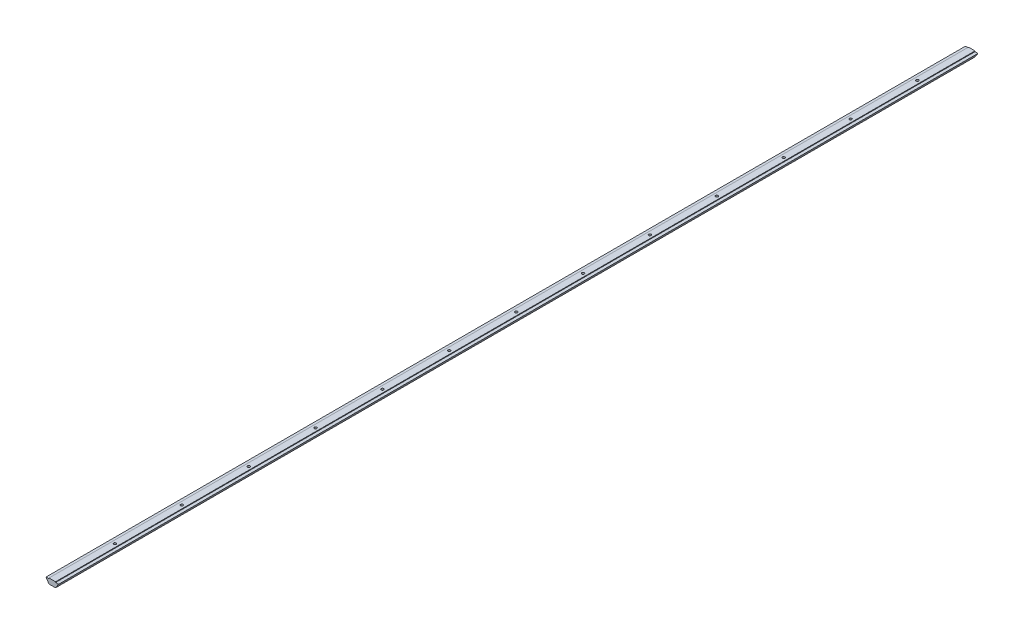
ISO-10303-21;
HEADER;
FILE_DESCRIPTION(('STEP AP214'),'2;1');
FILE_NAME('part.step','',(''),(''),'','','');
FILE_SCHEMA(('AUTOMOTIVE_DESIGN { 1 0 10303 214 1 1 1 1 }'));
ENDSEC;
DATA;
#1=APPLICATION_CONTEXT('core data for automotive mechanical design processes');
#2=APPLICATION_PROTOCOL_DEFINITION('international standard','automotive_design',2000,#1);
#3=PRODUCT_CONTEXT('',#1,'mechanical');
#4=PRODUCT('Part','Part','',(#3));
#5=PRODUCT_RELATED_PRODUCT_CATEGORY('part','',(#4));
#6=PRODUCT_DEFINITION_FORMATION('','',#4);
#7=PRODUCT_DEFINITION_CONTEXT('part definition',#1,'design');
#8=PRODUCT_DEFINITION('design','',#6,#7);
#9=PRODUCT_DEFINITION_SHAPE('','',#8);
#10=(LENGTH_UNIT() NAMED_UNIT(*) SI_UNIT(.MILLI.,.METRE.));
#11=(NAMED_UNIT(*) PLANE_ANGLE_UNIT() SI_UNIT($,.RADIAN.));
#12=(NAMED_UNIT(*) SI_UNIT($,.STERADIAN.) SOLID_ANGLE_UNIT());
#13=UNCERTAINTY_MEASURE_WITH_UNIT(LENGTH_MEASURE(1.E-05),#10,'distance_accuracy_value','');
#14=(GEOMETRIC_REPRESENTATION_CONTEXT(3) GLOBAL_UNCERTAINTY_ASSIGNED_CONTEXT((#13)) GLOBAL_UNIT_ASSIGNED_CONTEXT((#10,
#11,#12)) REPRESENTATION_CONTEXT('',''));
#15=CARTESIAN_POINT('',(0.,0.,0.));
#16=DIRECTION('',(0.,0.,1.));
#17=DIRECTION('',(1.,0.,0.));
#18=AXIS2_PLACEMENT_3D('',#15,#16,#17);
#19=CARTESIAN_POINT('',(-3.9,0.,1100.));
#20=DIRECTION('',(0.836701516894204,0.547659174694388,0.));
#21=DIRECTION('',(-0.547659174694388,0.836701516894204,0.));
#22=AXIS2_PLACEMENT_3D('',#19,#20,#21);
#23=PLANE('',#22);
#24=DIRECTION('',(0.547659174694388,-0.836701516894204,0.));
#25=VECTOR('',#24,1.);
#26=CARTESIAN_POINT('',(-3.9,0.,0.));
#27=LINE('',#26,#25);
#28=CARTESIAN_POINT('',(-7.5,5.5,0.));
#29=VERTEX_POINT('',#28);
#30=CARTESIAN_POINT('',(-3.9,0.,0.));
#31=VERTEX_POINT('',#30);
#32=EDGE_CURVE('E131',#29,#31,#27,.T.);
#33=ORIENTED_EDGE('',*,*,#32,.T.);
#34=DIRECTION('',(0.,0.,-1.));
#35=VECTOR('',#34,1.);
#36=CARTESIAN_POINT('',(-3.9,0.,1100.));
#37=LINE('',#36,#35);
#38=CARTESIAN_POINT('',(-3.9,0.,1100.));
#39=VERTEX_POINT('',#38);
#40=EDGE_CURVE('E11',#39,#31,#37,.T.);
#41=ORIENTED_EDGE('',*,*,#40,.F.);
#42=DIRECTION('',(0.547659174694388,-0.836701516894204,0.));
#43=VECTOR('',#42,1.);
#44=CARTESIAN_POINT('',(-3.9,0.,1100.));
#45=LINE('',#44,#43);
#46=CARTESIAN_POINT('',(-7.5,5.5,1100.));
#47=VERTEX_POINT('',#46);
#48=EDGE_CURVE('E146',#47,#39,#45,.T.);
#49=ORIENTED_EDGE('',*,*,#48,.F.);
#50=DIRECTION('',(0.,0.,-1.));
#51=VECTOR('',#50,1.);
#52=CARTESIAN_POINT('',(-7.5,5.5,1100.));
#53=LINE('',#52,#51);
#54=EDGE_CURVE('E127',#47,#29,#53,.T.);
#55=ORIENTED_EDGE('',*,*,#54,.T.);
#56=EDGE_LOOP('',(#33,#41,#49,#55));
#57=FACE_BOUND('',#56,.T.);
#58=ADVANCED_FACE('F35',(#57),#23,.F.);
#59=CARTESIAN_POINT('',(3.9,0.,1100.));
#60=DIRECTION('',(0.,1.,0.));
#61=DIRECTION('',(0.,0.,1.));
#62=AXIS2_PLACEMENT_3D('',#59,#60,#61);
#63=PLANE('',#62);
#64=CARTESIAN_POINT('',(0.,0.,1025.));
#65=DIRECTION('',(0.,1.,0.));
#66=DIRECTION('',(0.,0.,1.));
#67=AXIS2_PLACEMENT_3D('',#64,#65,#66);
#68=CIRCLE('',#67,1.49999999999997);
#69=CARTESIAN_POINT('',(0.,0.,1026.5));
#70=VERTEX_POINT('',#69);
#71=EDGE_CURVE('E248',#70,#70,#68,.T.);
#72=ORIENTED_EDGE('',*,*,#71,.T.);
#73=EDGE_LOOP('',(#72));
#74=FACE_BOUND('',#73,.T.);
#75=CARTESIAN_POINT('',(0.,0.,945.));
#76=DIRECTION('',(0.,1.,0.));
#77=DIRECTION('',(0.,0.,1.));
#78=AXIS2_PLACEMENT_3D('',#75,#76,#77);
#79=CIRCLE('',#78,1.5);
#80=CARTESIAN_POINT('',(0.,0.,946.5));
#81=VERTEX_POINT('',#80);
#82=EDGE_CURVE('E242',#81,#81,#79,.T.);
#83=ORIENTED_EDGE('',*,*,#82,.T.);
#84=EDGE_LOOP('',(#83));
#85=FACE_BOUND('',#84,.T.);
#86=CARTESIAN_POINT('',(0.,0.,865.));
#87=DIRECTION('',(0.,1.,0.));
#88=DIRECTION('',(0.,0.,1.));
#89=AXIS2_PLACEMENT_3D('',#86,#87,#88);
#90=CIRCLE('',#89,1.5);
#91=CARTESIAN_POINT('',(0.,0.,866.5));
#92=VERTEX_POINT('',#91);
#93=EDGE_CURVE('E236',#92,#92,#90,.T.);
#94=ORIENTED_EDGE('',*,*,#93,.T.);
#95=EDGE_LOOP('',(#94));
#96=FACE_BOUND('',#95,.T.);
#97=CARTESIAN_POINT('',(0.,0.,785.));
#98=DIRECTION('',(0.,1.,0.));
#99=DIRECTION('',(0.,0.,1.));
#100=AXIS2_PLACEMENT_3D('',#97,#98,#99);
#101=CIRCLE('',#100,1.5);
#102=CARTESIAN_POINT('',(0.,0.,786.5));
#103=VERTEX_POINT('',#102);
#104=EDGE_CURVE('E230',#103,#103,#101,.T.);
#105=ORIENTED_EDGE('',*,*,#104,.T.);
#106=EDGE_LOOP('',(#105));
#107=FACE_BOUND('',#106,.T.);
#108=CARTESIAN_POINT('',(0.,0.,705.));
#109=DIRECTION('',(0.,1.,0.));
#110=DIRECTION('',(0.,0.,1.));
#111=AXIS2_PLACEMENT_3D('',#108,#109,#110);
#112=CIRCLE('',#111,1.5);
#113=CARTESIAN_POINT('',(0.,0.,706.5));
#114=VERTEX_POINT('',#113);
#115=EDGE_CURVE('E224',#114,#114,#112,.T.);
#116=ORIENTED_EDGE('',*,*,#115,.T.);
#117=EDGE_LOOP('',(#116));
#118=FACE_BOUND('',#117,.T.);
#119=CARTESIAN_POINT('',(0.,0.,625.));
#120=DIRECTION('',(0.,1.,0.));
#121=DIRECTION('',(0.,0.,1.));
#122=AXIS2_PLACEMENT_3D('',#119,#120,#121);
#123=CIRCLE('',#122,1.5);
#124=CARTESIAN_POINT('',(0.,0.,626.5));
#125=VERTEX_POINT('',#124);
#126=EDGE_CURVE('E218',#125,#125,#123,.T.);
#127=ORIENTED_EDGE('',*,*,#126,.T.);
#128=EDGE_LOOP('',(#127));
#129=FACE_BOUND('',#128,.T.);
#130=CARTESIAN_POINT('',(0.,0.,545.));
#131=DIRECTION('',(0.,1.,0.));
#132=DIRECTION('',(0.,0.,1.));
#133=AXIS2_PLACEMENT_3D('',#130,#131,#132);
#134=CIRCLE('',#133,1.5);
#135=CARTESIAN_POINT('',(0.,0.,546.5));
#136=VERTEX_POINT('',#135);
#137=EDGE_CURVE('E212',#136,#136,#134,.T.);
#138=ORIENTED_EDGE('',*,*,#137,.T.);
#139=EDGE_LOOP('',(#138));
#140=FACE_BOUND('',#139,.T.);
#141=CARTESIAN_POINT('',(0.,0.,465.));
#142=DIRECTION('',(0.,1.,0.));
#143=DIRECTION('',(0.,0.,1.));
#144=AXIS2_PLACEMENT_3D('',#141,#142,#143);
#145=CIRCLE('',#144,1.5);
#146=CARTESIAN_POINT('',(0.,0.,466.5));
#147=VERTEX_POINT('',#146);
#148=EDGE_CURVE('E206',#147,#147,#145,.T.);
#149=ORIENTED_EDGE('',*,*,#148,.T.);
#150=EDGE_LOOP('',(#149));
#151=FACE_BOUND('',#150,.T.);
#152=CARTESIAN_POINT('',(0.,0.,385.));
#153=DIRECTION('',(0.,1.,0.));
#154=DIRECTION('',(0.,0.,1.));
#155=AXIS2_PLACEMENT_3D('',#152,#153,#154);
#156=CIRCLE('',#155,1.5);
#157=CARTESIAN_POINT('',(0.,0.,386.5));
#158=VERTEX_POINT('',#157);
#159=EDGE_CURVE('E200',#158,#158,#156,.T.);
#160=ORIENTED_EDGE('',*,*,#159,.T.);
#161=EDGE_LOOP('',(#160));
#162=FACE_BOUND('',#161,.T.);
#163=CARTESIAN_POINT('',(0.,0.,305.));
#164=DIRECTION('',(0.,1.,0.));
#165=DIRECTION('',(0.,0.,1.));
#166=AXIS2_PLACEMENT_3D('',#163,#164,#165);
#167=CIRCLE('',#166,1.5);
#168=CARTESIAN_POINT('',(0.,0.,306.5));
#169=VERTEX_POINT('',#168);
#170=EDGE_CURVE('E194',#169,#169,#167,.T.);
#171=ORIENTED_EDGE('',*,*,#170,.T.);
#172=EDGE_LOOP('',(#171));
#173=FACE_BOUND('',#172,.T.);
#174=CARTESIAN_POINT('',(0.,0.,225.));
#175=DIRECTION('',(0.,1.,0.));
#176=DIRECTION('',(0.,0.,1.));
#177=AXIS2_PLACEMENT_3D('',#174,#175,#176);
#178=CIRCLE('',#177,1.5);
#179=CARTESIAN_POINT('',(0.,0.,226.5));
#180=VERTEX_POINT('',#179);
#181=EDGE_CURVE('E188',#180,#180,#178,.T.);
#182=ORIENTED_EDGE('',*,*,#181,.T.);
#183=EDGE_LOOP('',(#182));
#184=FACE_BOUND('',#183,.T.);
#185=CARTESIAN_POINT('',(0.,0.,145.));
#186=DIRECTION('',(0.,1.,0.));
#187=DIRECTION('',(0.,0.,1.));
#188=AXIS2_PLACEMENT_3D('',#185,#186,#187);
#189=CIRCLE('',#188,1.5);
#190=CARTESIAN_POINT('',(0.,0.,146.5));
#191=VERTEX_POINT('',#190);
#192=EDGE_CURVE('E182',#191,#191,#189,.T.);
#193=ORIENTED_EDGE('',*,*,#192,.T.);
#194=EDGE_LOOP('',(#193));
#195=FACE_BOUND('',#194,.T.);
#196=CARTESIAN_POINT('',(0.,0.,65.));
#197=DIRECTION('',(0.,1.,0.));
#198=DIRECTION('',(0.,0.,1.));
#199=AXIS2_PLACEMENT_3D('',#196,#197,#198);
#200=CIRCLE('',#199,1.5);
#201=CARTESIAN_POINT('',(0.,0.,66.5));
#202=VERTEX_POINT('',#201);
#203=EDGE_CURVE('E135',#202,#202,#200,.T.);
#204=ORIENTED_EDGE('',*,*,#203,.T.);
#205=EDGE_LOOP('',(#204));
#206=FACE_BOUND('',#205,.T.);
#207=DIRECTION('',(1.,0.,0.));
#208=VECTOR('',#207,1.);
#209=CARTESIAN_POINT('',(3.9,0.,0.));
#210=LINE('',#209,#208);
#211=CARTESIAN_POINT('',(3.9,0.,0.));
#212=VERTEX_POINT('',#211);
#213=EDGE_CURVE('E134',#31,#212,#210,.T.);
#214=ORIENTED_EDGE('',*,*,#213,.T.);
#215=DIRECTION('',(0.,0.,-1.));
#216=VECTOR('',#215,1.);
#217=CARTESIAN_POINT('',(3.9,0.,1100.));
#218=LINE('',#217,#216);
#219=CARTESIAN_POINT('',(3.9,0.,1100.));
#220=VERTEX_POINT('',#219);
#221=EDGE_CURVE('E43',#220,#212,#218,.T.);
#222=ORIENTED_EDGE('',*,*,#221,.F.);
#223=DIRECTION('',(1.,0.,0.));
#224=VECTOR('',#223,1.);
#225=CARTESIAN_POINT('',(3.9,0.,1100.));
#226=LINE('',#225,#224);
#227=EDGE_CURVE('E94',#39,#220,#226,.T.);
#228=ORIENTED_EDGE('',*,*,#227,.F.);
#229=ORIENTED_EDGE('',*,*,#40,.T.);
#230=EDGE_LOOP('',(#214,#222,#228,#229));
#231=FACE_BOUND('',#230,.T.);
#232=ADVANCED_FACE('F257',(#74,#85,#96,#107,#118,#129,#140,#151,#162,#173,#184,#195,#206,#231),
#63,.F.);
#233=CARTESIAN_POINT('',(3.9,0.,1100.));
#234=DIRECTION('',(-0.836701516894204,0.547659174694388,0.));
#235=DIRECTION('',(-0.547659174694388,-0.836701516894204,0.));
#236=AXIS2_PLACEMENT_3D('',#233,#234,#235);
#237=PLANE('',#236);
#238=DIRECTION('',(0.547659174694388,0.836701516894204,0.));
#239=VECTOR('',#238,1.);
#240=CARTESIAN_POINT('',(3.9,0.,0.));
#241=LINE('',#240,#239);
#242=CARTESIAN_POINT('',(7.5,5.5,0.));
#243=VERTEX_POINT('',#242);
#244=EDGE_CURVE('E137',#212,#243,#241,.T.);
#245=ORIENTED_EDGE('',*,*,#244,.T.);
#246=DIRECTION('',(0.,0.,-1.));
#247=VECTOR('',#246,1.);
#248=CARTESIAN_POINT('',(7.5,5.5,1100.));
#249=LINE('',#248,#247);
#250=CARTESIAN_POINT('',(7.5,5.5,1100.));
#251=VERTEX_POINT('',#250);
#252=EDGE_CURVE('E153',#251,#243,#249,.T.);
#253=ORIENTED_EDGE('',*,*,#252,.F.);
#254=DIRECTION('',(0.547659174694388,0.836701516894204,0.));
#255=VECTOR('',#254,1.);
#256=CARTESIAN_POINT('',(3.9,0.,1100.));
#257=LINE('',#256,#255);
#258=EDGE_CURVE('E161',#220,#251,#257,.T.);
#259=ORIENTED_EDGE('',*,*,#258,.F.);
#260=ORIENTED_EDGE('',*,*,#221,.T.);
#261=EDGE_LOOP('',(#245,#253,#259,#260));
#262=FACE_BOUND('',#261,.T.);
#263=ADVANCED_FACE('F159',(#262),#237,.F.);
#264=CARTESIAN_POINT('',(7.5,5.5,1100.));
#265=DIRECTION('',(0.,-1.,0.));
#266=DIRECTION('',(0.,0.,-1.));
#267=AXIS2_PLACEMENT_3D('',#264,#265,#266);
#268=PLANE('',#267);
#269=DIRECTION('',(-1.,0.,0.));
#270=VECTOR('',#269,1.);
#271=CARTESIAN_POINT('',(7.5,5.5,0.));
#272=LINE('',#271,#270);
#273=CARTESIAN_POINT('',(3.9,5.5,0.));
#274=VERTEX_POINT('',#273);
#275=EDGE_CURVE('E139',#243,#274,#272,.T.);
#276=ORIENTED_EDGE('',*,*,#275,.T.);
#277=DIRECTION('',(0.,0.,-1.));
#278=VECTOR('',#277,1.);
#279=CARTESIAN_POINT('',(3.9,5.5,1100.));
#280=LINE('',#279,#278);
#281=CARTESIAN_POINT('',(3.9,5.5,1100.));
#282=VERTEX_POINT('',#281);
#283=EDGE_CURVE('E150',#282,#274,#280,.T.);
#284=ORIENTED_EDGE('',*,*,#283,.F.);
#285=DIRECTION('',(-1.,0.,0.));
#286=VECTOR('',#285,1.);
#287=CARTESIAN_POINT('',(7.5,5.5,1100.));
#288=LINE('',#287,#286);
#289=EDGE_CURVE('E173',#251,#282,#288,.T.);
#290=ORIENTED_EDGE('',*,*,#289,.F.);
#291=ORIENTED_EDGE('',*,*,#252,.T.);
#292=EDGE_LOOP('',(#276,#284,#290,#291));
#293=FACE_BOUND('',#292,.T.);
#294=ADVANCED_FACE('F169',(#293),#268,.F.);
#295=CARTESIAN_POINT('',(3.9,5.5,1100.));
#296=DIRECTION('',(-1.,0.,0.));
#297=DIRECTION('',(0.,-1.,0.));
#298=AXIS2_PLACEMENT_3D('',#295,#296,#297);
#299=PLANE('',#298);
#300=DIRECTION('',(0.,1.,0.));
#301=VECTOR('',#300,1.);
#302=CARTESIAN_POINT('',(3.9,5.5,0.));
#303=LINE('',#302,#301);
#304=CARTESIAN_POINT('',(3.9,6.3,0.));
#305=VERTEX_POINT('',#304);
#306=EDGE_CURVE('E141',#274,#305,#303,.T.);
#307=ORIENTED_EDGE('',*,*,#306,.T.);
#308=DIRECTION('',(0.,0.,-1.));
#309=VECTOR('',#308,1.);
#310=CARTESIAN_POINT('',(3.9,6.3,1100.));
#311=LINE('',#310,#309);
#312=CARTESIAN_POINT('',(3.9,6.3,1100.));
#313=VERTEX_POINT('',#312);
#314=EDGE_CURVE('E122',#313,#305,#311,.T.);
#315=ORIENTED_EDGE('',*,*,#314,.F.);
#316=DIRECTION('',(0.,1.,0.));
#317=VECTOR('',#316,1.);
#318=CARTESIAN_POINT('',(3.9,5.5,1100.));
#319=LINE('',#318,#317);
#320=EDGE_CURVE('E113',#282,#313,#319,.T.);
#321=ORIENTED_EDGE('',*,*,#320,.F.);
#322=ORIENTED_EDGE('',*,*,#283,.T.);
#323=EDGE_LOOP('',(#307,#315,#321,#322));
#324=FACE_BOUND('',#323,.T.);
#325=ADVANCED_FACE('F172',(#324),#299,.F.);
#326=CARTESIAN_POINT('',(-3.9,6.3,1100.));
#327=DIRECTION('',(0.,-1.,0.));
#328=DIRECTION('',(0.,0.,-1.));
#329=AXIS2_PLACEMENT_3D('',#326,#327,#328);
#330=PLANE('',#329);
#331=CARTESIAN_POINT('',(0.,6.3,1025.));
#332=DIRECTION('',(0.,1.,0.));
#333=DIRECTION('',(0.,0.,1.));
#334=AXIS2_PLACEMENT_3D('',#331,#332,#333);
#335=CIRCLE('',#334,1.49999999999997);
#336=CARTESIAN_POINT('',(0.,6.3,1026.5));
#337=VERTEX_POINT('',#336);
#338=EDGE_CURVE('E251',#337,#337,#335,.T.);
#339=ORIENTED_EDGE('',*,*,#338,.F.);
#340=EDGE_LOOP('',(#339));
#341=FACE_BOUND('',#340,.T.);
#342=CARTESIAN_POINT('',(0.,6.3,945.));
#343=DIRECTION('',(0.,1.,0.));
#344=DIRECTION('',(0.,0.,1.));
#345=AXIS2_PLACEMENT_3D('',#342,#343,#344);
#346=CIRCLE('',#345,1.5);
#347=CARTESIAN_POINT('',(0.,6.3,946.5));
#348=VERTEX_POINT('',#347);
#349=EDGE_CURVE('E245',#348,#348,#346,.T.);
#350=ORIENTED_EDGE('',*,*,#349,.F.);
#351=EDGE_LOOP('',(#350));
#352=FACE_BOUND('',#351,.T.);
#353=CARTESIAN_POINT('',(0.,6.3,865.));
#354=DIRECTION('',(0.,1.,0.));
#355=DIRECTION('',(0.,0.,1.));
#356=AXIS2_PLACEMENT_3D('',#353,#354,#355);
#357=CIRCLE('',#356,1.5);
#358=CARTESIAN_POINT('',(0.,6.3,866.5));
#359=VERTEX_POINT('',#358);
#360=EDGE_CURVE('E239',#359,#359,#357,.T.);
#361=ORIENTED_EDGE('',*,*,#360,.F.);
#362=EDGE_LOOP('',(#361));
#363=FACE_BOUND('',#362,.T.);
#364=CARTESIAN_POINT('',(0.,6.3,785.));
#365=DIRECTION('',(0.,1.,0.));
#366=DIRECTION('',(0.,0.,1.));
#367=AXIS2_PLACEMENT_3D('',#364,#365,#366);
#368=CIRCLE('',#367,1.5);
#369=CARTESIAN_POINT('',(0.,6.3,786.5));
#370=VERTEX_POINT('',#369);
#371=EDGE_CURVE('E233',#370,#370,#368,.T.);
#372=ORIENTED_EDGE('',*,*,#371,.F.);
#373=EDGE_LOOP('',(#372));
#374=FACE_BOUND('',#373,.T.);
#375=CARTESIAN_POINT('',(0.,6.3,705.));
#376=DIRECTION('',(0.,1.,0.));
#377=DIRECTION('',(0.,0.,1.));
#378=AXIS2_PLACEMENT_3D('',#375,#376,#377);
#379=CIRCLE('',#378,1.5);
#380=CARTESIAN_POINT('',(0.,6.3,706.5));
#381=VERTEX_POINT('',#380);
#382=EDGE_CURVE('E227',#381,#381,#379,.T.);
#383=ORIENTED_EDGE('',*,*,#382,.F.);
#384=EDGE_LOOP('',(#383));
#385=FACE_BOUND('',#384,.T.);
#386=CARTESIAN_POINT('',(0.,6.3,625.));
#387=DIRECTION('',(0.,1.,0.));
#388=DIRECTION('',(0.,0.,1.));
#389=AXIS2_PLACEMENT_3D('',#386,#387,#388);
#390=CIRCLE('',#389,1.5);
#391=CARTESIAN_POINT('',(0.,6.3,626.5));
#392=VERTEX_POINT('',#391);
#393=EDGE_CURVE('E221',#392,#392,#390,.T.);
#394=ORIENTED_EDGE('',*,*,#393,.F.);
#395=EDGE_LOOP('',(#394));
#396=FACE_BOUND('',#395,.T.);
#397=CARTESIAN_POINT('',(0.,6.3,545.));
#398=DIRECTION('',(0.,1.,0.));
#399=DIRECTION('',(0.,0.,1.));
#400=AXIS2_PLACEMENT_3D('',#397,#398,#399);
#401=CIRCLE('',#400,1.5);
#402=CARTESIAN_POINT('',(0.,6.3,546.5));
#403=VERTEX_POINT('',#402);
#404=EDGE_CURVE('E215',#403,#403,#401,.T.);
#405=ORIENTED_EDGE('',*,*,#404,.F.);
#406=EDGE_LOOP('',(#405));
#407=FACE_BOUND('',#406,.T.);
#408=CARTESIAN_POINT('',(0.,6.3,465.));
#409=DIRECTION('',(0.,1.,0.));
#410=DIRECTION('',(0.,0.,1.));
#411=AXIS2_PLACEMENT_3D('',#408,#409,#410);
#412=CIRCLE('',#411,1.5);
#413=CARTESIAN_POINT('',(0.,6.3,466.5));
#414=VERTEX_POINT('',#413);
#415=EDGE_CURVE('E209',#414,#414,#412,.T.);
#416=ORIENTED_EDGE('',*,*,#415,.F.);
#417=EDGE_LOOP('',(#416));
#418=FACE_BOUND('',#417,.T.);
#419=CARTESIAN_POINT('',(0.,6.3,385.));
#420=DIRECTION('',(0.,1.,0.));
#421=DIRECTION('',(0.,0.,1.));
#422=AXIS2_PLACEMENT_3D('',#419,#420,#421);
#423=CIRCLE('',#422,1.5);
#424=CARTESIAN_POINT('',(0.,6.3,386.5));
#425=VERTEX_POINT('',#424);
#426=EDGE_CURVE('E203',#425,#425,#423,.T.);
#427=ORIENTED_EDGE('',*,*,#426,.F.);
#428=EDGE_LOOP('',(#427));
#429=FACE_BOUND('',#428,.T.);
#430=CARTESIAN_POINT('',(0.,6.3,305.));
#431=DIRECTION('',(0.,1.,0.));
#432=DIRECTION('',(0.,0.,1.));
#433=AXIS2_PLACEMENT_3D('',#430,#431,#432);
#434=CIRCLE('',#433,1.5);
#435=CARTESIAN_POINT('',(0.,6.3,306.5));
#436=VERTEX_POINT('',#435);
#437=EDGE_CURVE('E197',#436,#436,#434,.T.);
#438=ORIENTED_EDGE('',*,*,#437,.F.);
#439=EDGE_LOOP('',(#438));
#440=FACE_BOUND('',#439,.T.);
#441=CARTESIAN_POINT('',(0.,6.3,225.));
#442=DIRECTION('',(0.,1.,0.));
#443=DIRECTION('',(0.,0.,1.));
#444=AXIS2_PLACEMENT_3D('',#441,#442,#443);
#445=CIRCLE('',#444,1.5);
#446=CARTESIAN_POINT('',(0.,6.3,226.5));
#447=VERTEX_POINT('',#446);
#448=EDGE_CURVE('E191',#447,#447,#445,.T.);
#449=ORIENTED_EDGE('',*,*,#448,.F.);
#450=EDGE_LOOP('',(#449));
#451=FACE_BOUND('',#450,.T.);
#452=CARTESIAN_POINT('',(0.,6.3,145.));
#453=DIRECTION('',(0.,1.,0.));
#454=DIRECTION('',(0.,0.,1.));
#455=AXIS2_PLACEMENT_3D('',#452,#453,#454);
#456=CIRCLE('',#455,1.5);
#457=CARTESIAN_POINT('',(0.,6.3,146.5));
#458=VERTEX_POINT('',#457);
#459=EDGE_CURVE('E185',#458,#458,#456,.T.);
#460=ORIENTED_EDGE('',*,*,#459,.F.);
#461=EDGE_LOOP('',(#460));
#462=FACE_BOUND('',#461,.T.);
#463=CARTESIAN_POINT('',(0.,6.3,65.));
#464=DIRECTION('',(0.,1.,0.));
#465=DIRECTION('',(0.,0.,1.));
#466=AXIS2_PLACEMENT_3D('',#463,#464,#465);
#467=CIRCLE('',#466,1.5);
#468=CARTESIAN_POINT('',(0.,6.3,66.5));
#469=VERTEX_POINT('',#468);
#470=EDGE_CURVE('E179',#469,#469,#467,.T.);
#471=ORIENTED_EDGE('',*,*,#470,.F.);
#472=EDGE_LOOP('',(#471));
#473=FACE_BOUND('',#472,.T.);
#474=DIRECTION('',(-1.,0.,0.));
#475=VECTOR('',#474,1.);
#476=CARTESIAN_POINT('',(-3.9,6.3,0.));
#477=LINE('',#476,#475);
#478=CARTESIAN_POINT('',(-3.9,6.3,0.));
#479=VERTEX_POINT('',#478);
#480=EDGE_CURVE('E121',#305,#479,#477,.T.);
#481=ORIENTED_EDGE('',*,*,#480,.T.);
#482=DIRECTION('',(0.,0.,-1.));
#483=VECTOR('',#482,1.);
#484=CARTESIAN_POINT('',(-3.9,6.3,1100.));
#485=LINE('',#484,#483);
#486=CARTESIAN_POINT('',(-3.9,6.3,1100.));
#487=VERTEX_POINT('',#486);
#488=EDGE_CURVE('E118',#487,#479,#485,.T.);
#489=ORIENTED_EDGE('',*,*,#488,.F.);
#490=DIRECTION('',(-1.,0.,0.));
#491=VECTOR('',#490,1.);
#492=CARTESIAN_POINT('',(-3.9,6.3,1100.));
#493=LINE('',#492,#491);
#494=EDGE_CURVE('E107',#313,#487,#493,.T.);
#495=ORIENTED_EDGE('',*,*,#494,.F.);
#496=ORIENTED_EDGE('',*,*,#314,.T.);
#497=EDGE_LOOP('',(#481,#489,#495,#496));
#498=FACE_BOUND('',#497,.T.);
#499=ADVANCED_FACE('F119',(#341,#352,#363,#374,#385,#396,#407,#418,#429,#440,#451,#462,#473,
#498),#330,.F.);
#500=CARTESIAN_POINT('',(-3.9,5.5,1100.));
#501=DIRECTION('',(1.,0.,0.));
#502=DIRECTION('',(0.,1.,0.));
#503=AXIS2_PLACEMENT_3D('',#500,#501,#502);
#504=PLANE('',#503);
#505=DIRECTION('',(0.,-1.,0.));
#506=VECTOR('',#505,1.);
#507=CARTESIAN_POINT('',(-3.9,5.5,0.));
#508=LINE('',#507,#506);
#509=CARTESIAN_POINT('',(-3.9,5.5,0.));
#510=VERTEX_POINT('',#509);
#511=EDGE_CURVE('E80',#479,#510,#508,.T.);
#512=ORIENTED_EDGE('',*,*,#511,.T.);
#513=DIRECTION('',(0.,0.,-1.));
#514=VECTOR('',#513,1.);
#515=CARTESIAN_POINT('',(-3.9,5.5,1100.));
#516=LINE('',#515,#514);
#517=CARTESIAN_POINT('',(-3.9,5.5,1100.));
#518=VERTEX_POINT('',#517);
#519=EDGE_CURVE('E123',#518,#510,#516,.T.);
#520=ORIENTED_EDGE('',*,*,#519,.F.);
#521=DIRECTION('',(0.,-1.,0.));
#522=VECTOR('',#521,1.);
#523=CARTESIAN_POINT('',(-3.9,5.5,1100.));
#524=LINE('',#523,#522);
#525=EDGE_CURVE('E111',#487,#518,#524,.T.);
#526=ORIENTED_EDGE('',*,*,#525,.F.);
#527=ORIENTED_EDGE('',*,*,#488,.T.);
#528=EDGE_LOOP('',(#512,#520,#526,#527));
#529=FACE_BOUND('',#528,.T.);
#530=ADVANCED_FACE('F125',(#529),#504,.F.);
#531=CARTESIAN_POINT('',(-7.5,5.5,1100.));
#532=DIRECTION('',(0.,-1.,0.));
#533=DIRECTION('',(0.,0.,-1.));
#534=AXIS2_PLACEMENT_3D('',#531,#532,#533);
#535=PLANE('',#534);
#536=DIRECTION('',(-1.,0.,0.));
#537=VECTOR('',#536,1.);
#538=CARTESIAN_POINT('',(-7.5,5.5,0.));
#539=LINE('',#538,#537);
#540=EDGE_CURVE('E86',#510,#29,#539,.T.);
#541=ORIENTED_EDGE('',*,*,#540,.T.);
#542=ORIENTED_EDGE('',*,*,#54,.F.);
#543=DIRECTION('',(-1.,0.,0.));
#544=VECTOR('',#543,1.);
#545=CARTESIAN_POINT('',(-7.5,5.5,1100.));
#546=LINE('',#545,#544);
#547=EDGE_CURVE('E51',#518,#47,#546,.T.);
#548=ORIENTED_EDGE('',*,*,#547,.F.);
#549=ORIENTED_EDGE('',*,*,#519,.T.);
#550=EDGE_LOOP('',(#541,#542,#548,#549));
#551=FACE_BOUND('',#550,.T.);
#552=ADVANCED_FACE('F316',(#551),#535,.F.);
#553=CARTESIAN_POINT('',(0.,0.,1100.));
#554=DIRECTION('',(0.,0.,-1.));
#555=DIRECTION('',(-1.,0.,0.));
#556=AXIS2_PLACEMENT_3D('',#553,#554,#555);
#557=PLANE('',#556);
#558=ORIENTED_EDGE('',*,*,#48,.T.);
#559=ORIENTED_EDGE('',*,*,#227,.T.);
#560=ORIENTED_EDGE('',*,*,#258,.T.);
#561=ORIENTED_EDGE('',*,*,#289,.T.);
#562=ORIENTED_EDGE('',*,*,#320,.T.);
#563=ORIENTED_EDGE('',*,*,#494,.T.);
#564=ORIENTED_EDGE('',*,*,#525,.T.);
#565=ORIENTED_EDGE('',*,*,#547,.T.);
#566=EDGE_LOOP('',(#558,#559,#560,#561,#562,#563,#564,#565));
#567=FACE_BOUND('',#566,.T.);
#568=ADVANCED_FACE('F109',(#567),#557,.F.);
#569=CARTESIAN_POINT('',(0.,0.,0.));
#570=DIRECTION('',(0.,0.,-1.));
#571=DIRECTION('',(-1.,0.,0.));
#572=AXIS2_PLACEMENT_3D('',#569,#570,#571);
#573=PLANE('',#572);
#574=ORIENTED_EDGE('',*,*,#32,.F.);
#575=ORIENTED_EDGE('',*,*,#540,.F.);
#576=ORIENTED_EDGE('',*,*,#511,.F.);
#577=ORIENTED_EDGE('',*,*,#480,.F.);
#578=ORIENTED_EDGE('',*,*,#306,.F.);
#579=ORIENTED_EDGE('',*,*,#275,.F.);
#580=ORIENTED_EDGE('',*,*,#244,.F.);
#581=ORIENTED_EDGE('',*,*,#213,.F.);
#582=EDGE_LOOP('',(#574,#575,#576,#577,#578,#579,#580,#581));
#583=FACE_BOUND('',#582,.T.);
#584=ADVANCED_FACE('F165',(#583),#573,.T.);
#585=CARTESIAN_POINT('',(0.,0.,65.));
#586=DIRECTION('',(0.,1.,0.));
#587=DIRECTION('',(0.,0.,1.));
#588=AXIS2_PLACEMENT_3D('',#585,#586,#587);
#589=CYLINDRICAL_SURFACE('',#588,1.5);
#590=ORIENTED_EDGE('',*,*,#203,.F.);
#591=EDGE_LOOP('',(#590));
#592=FACE_BOUND('',#591,.T.);
#593=ORIENTED_EDGE('',*,*,#470,.T.);
#594=EDGE_LOOP('',(#593));
#595=FACE_BOUND('',#594,.T.);
#596=ADVANCED_FACE('F294',(#592,#595),#589,.F.);
#597=CARTESIAN_POINT('',(0.,0.,145.));
#598=DIRECTION('',(0.,1.,0.));
#599=DIRECTION('',(0.,0.,1.));
#600=AXIS2_PLACEMENT_3D('',#597,#598,#599);
#601=CYLINDRICAL_SURFACE('',#600,1.5);
#602=ORIENTED_EDGE('',*,*,#192,.F.);
#603=EDGE_LOOP('',(#602));
#604=FACE_BOUND('',#603,.T.);
#605=ORIENTED_EDGE('',*,*,#459,.T.);
#606=EDGE_LOOP('',(#605));
#607=FACE_BOUND('',#606,.T.);
#608=ADVANCED_FACE('F296',(#604,#607),#601,.F.);
#609=CARTESIAN_POINT('',(0.,0.,225.));
#610=DIRECTION('',(0.,1.,0.));
#611=DIRECTION('',(0.,0.,1.));
#612=AXIS2_PLACEMENT_3D('',#609,#610,#611);
#613=CYLINDRICAL_SURFACE('',#612,1.5);
#614=ORIENTED_EDGE('',*,*,#181,.F.);
#615=EDGE_LOOP('',(#614));
#616=FACE_BOUND('',#615,.T.);
#617=ORIENTED_EDGE('',*,*,#448,.T.);
#618=EDGE_LOOP('',(#617));
#619=FACE_BOUND('',#618,.T.);
#620=ADVANCED_FACE('F303',(#616,#619),#613,.F.);
#621=CARTESIAN_POINT('',(0.,0.,305.));
#622=DIRECTION('',(0.,1.,0.));
#623=DIRECTION('',(0.,0.,1.));
#624=AXIS2_PLACEMENT_3D('',#621,#622,#623);
#625=CYLINDRICAL_SURFACE('',#624,1.5);
#626=ORIENTED_EDGE('',*,*,#170,.F.);
#627=EDGE_LOOP('',(#626));
#628=FACE_BOUND('',#627,.T.);
#629=ORIENTED_EDGE('',*,*,#437,.T.);
#630=EDGE_LOOP('',(#629));
#631=FACE_BOUND('',#630,.T.);
#632=ADVANCED_FACE('F401',(#628,#631),#625,.F.);
#633=CARTESIAN_POINT('',(0.,0.,385.));
#634=DIRECTION('',(0.,1.,0.));
#635=DIRECTION('',(0.,0.,1.));
#636=AXIS2_PLACEMENT_3D('',#633,#634,#635);
#637=CYLINDRICAL_SURFACE('',#636,1.5);
#638=ORIENTED_EDGE('',*,*,#159,.F.);
#639=EDGE_LOOP('',(#638));
#640=FACE_BOUND('',#639,.T.);
#641=ORIENTED_EDGE('',*,*,#426,.T.);
#642=EDGE_LOOP('',(#641));
#643=FACE_BOUND('',#642,.T.);
#644=ADVANCED_FACE('F410',(#640,#643),#637,.F.);
#645=CARTESIAN_POINT('',(0.,0.,465.));
#646=DIRECTION('',(0.,1.,0.));
#647=DIRECTION('',(0.,0.,1.));
#648=AXIS2_PLACEMENT_3D('',#645,#646,#647);
#649=CYLINDRICAL_SURFACE('',#648,1.5);
#650=ORIENTED_EDGE('',*,*,#148,.F.);
#651=EDGE_LOOP('',(#650));
#652=FACE_BOUND('',#651,.T.);
#653=ORIENTED_EDGE('',*,*,#415,.T.);
#654=EDGE_LOOP('',(#653));
#655=FACE_BOUND('',#654,.T.);
#656=ADVANCED_FACE('F419',(#652,#655),#649,.F.);
#657=CARTESIAN_POINT('',(0.,0.,545.));
#658=DIRECTION('',(0.,1.,0.));
#659=DIRECTION('',(0.,0.,1.));
#660=AXIS2_PLACEMENT_3D('',#657,#658,#659);
#661=CYLINDRICAL_SURFACE('',#660,1.5);
#662=ORIENTED_EDGE('',*,*,#137,.F.);
#663=EDGE_LOOP('',(#662));
#664=FACE_BOUND('',#663,.T.);
#665=ORIENTED_EDGE('',*,*,#404,.T.);
#666=EDGE_LOOP('',(#665));
#667=FACE_BOUND('',#666,.T.);
#668=ADVANCED_FACE('F428',(#664,#667),#661,.F.);
#669=CARTESIAN_POINT('',(0.,0.,625.));
#670=DIRECTION('',(0.,1.,0.));
#671=DIRECTION('',(0.,0.,1.));
#672=AXIS2_PLACEMENT_3D('',#669,#670,#671);
#673=CYLINDRICAL_SURFACE('',#672,1.5);
#674=ORIENTED_EDGE('',*,*,#126,.F.);
#675=EDGE_LOOP('',(#674));
#676=FACE_BOUND('',#675,.T.);
#677=ORIENTED_EDGE('',*,*,#393,.T.);
#678=EDGE_LOOP('',(#677));
#679=FACE_BOUND('',#678,.T.);
#680=ADVANCED_FACE('F437',(#676,#679),#673,.F.);
#681=CARTESIAN_POINT('',(0.,0.,705.));
#682=DIRECTION('',(0.,1.,0.));
#683=DIRECTION('',(0.,0.,1.));
#684=AXIS2_PLACEMENT_3D('',#681,#682,#683);
#685=CYLINDRICAL_SURFACE('',#684,1.5);
#686=ORIENTED_EDGE('',*,*,#115,.F.);
#687=EDGE_LOOP('',(#686));
#688=FACE_BOUND('',#687,.T.);
#689=ORIENTED_EDGE('',*,*,#382,.T.);
#690=EDGE_LOOP('',(#689));
#691=FACE_BOUND('',#690,.T.);
#692=ADVANCED_FACE('F446',(#688,#691),#685,.F.);
#693=CARTESIAN_POINT('',(0.,0.,785.));
#694=DIRECTION('',(0.,1.,0.));
#695=DIRECTION('',(0.,0.,1.));
#696=AXIS2_PLACEMENT_3D('',#693,#694,#695);
#697=CYLINDRICAL_SURFACE('',#696,1.5);
#698=ORIENTED_EDGE('',*,*,#104,.F.);
#699=EDGE_LOOP('',(#698));
#700=FACE_BOUND('',#699,.T.);
#701=ORIENTED_EDGE('',*,*,#371,.T.);
#702=EDGE_LOOP('',(#701));
#703=FACE_BOUND('',#702,.T.);
#704=ADVANCED_FACE('F455',(#700,#703),#697,.F.);
#705=CARTESIAN_POINT('',(0.,0.,865.));
#706=DIRECTION('',(0.,1.,0.));
#707=DIRECTION('',(0.,0.,1.));
#708=AXIS2_PLACEMENT_3D('',#705,#706,#707);
#709=CYLINDRICAL_SURFACE('',#708,1.5);
#710=ORIENTED_EDGE('',*,*,#93,.F.);
#711=EDGE_LOOP('',(#710));
#712=FACE_BOUND('',#711,.T.);
#713=ORIENTED_EDGE('',*,*,#360,.T.);
#714=EDGE_LOOP('',(#713));
#715=FACE_BOUND('',#714,.T.);
#716=ADVANCED_FACE('F464',(#712,#715),#709,.F.);
#717=CARTESIAN_POINT('',(0.,0.,945.));
#718=DIRECTION('',(0.,1.,0.));
#719=DIRECTION('',(0.,0.,1.));
#720=AXIS2_PLACEMENT_3D('',#717,#718,#719);
#721=CYLINDRICAL_SURFACE('',#720,1.5);
#722=ORIENTED_EDGE('',*,*,#82,.F.);
#723=EDGE_LOOP('',(#722));
#724=FACE_BOUND('',#723,.T.);
#725=ORIENTED_EDGE('',*,*,#349,.T.);
#726=EDGE_LOOP('',(#725));
#727=FACE_BOUND('',#726,.T.);
#728=ADVANCED_FACE('F263',(#724,#727),#721,.F.);
#729=CARTESIAN_POINT('',(0.,0.,1025.));
#730=DIRECTION('',(0.,1.,0.));
#731=DIRECTION('',(0.,0.,1.));
#732=AXIS2_PLACEMENT_3D('',#729,#730,#731);
#733=CYLINDRICAL_SURFACE('',#732,1.49999999999997);
#734=ORIENTED_EDGE('',*,*,#71,.F.);
#735=EDGE_LOOP('',(#734));
#736=FACE_BOUND('',#735,.T.);
#737=ORIENTED_EDGE('',*,*,#338,.T.);
#738=EDGE_LOOP('',(#737));
#739=FACE_BOUND('',#738,.T.);
#740=ADVANCED_FACE('F260',(#736,#739),#733,.F.);
#741=CLOSED_SHELL('',(#58,#232,#263,#294,#325,#499,#530,#552,#568,#584,#596,#608,#620,#632,#644,
#656,#668,#680,#692,#704,#716,#728,#740));
#742=MANIFOLD_SOLID_BREP('B2',#741);
#743=ADVANCED_BREP_SHAPE_REPRESENTATION('',(#18,#742),#14);
#744=SHAPE_DEFINITION_REPRESENTATION(#9,#743);
ENDSEC;
END-ISO-10303-21;
